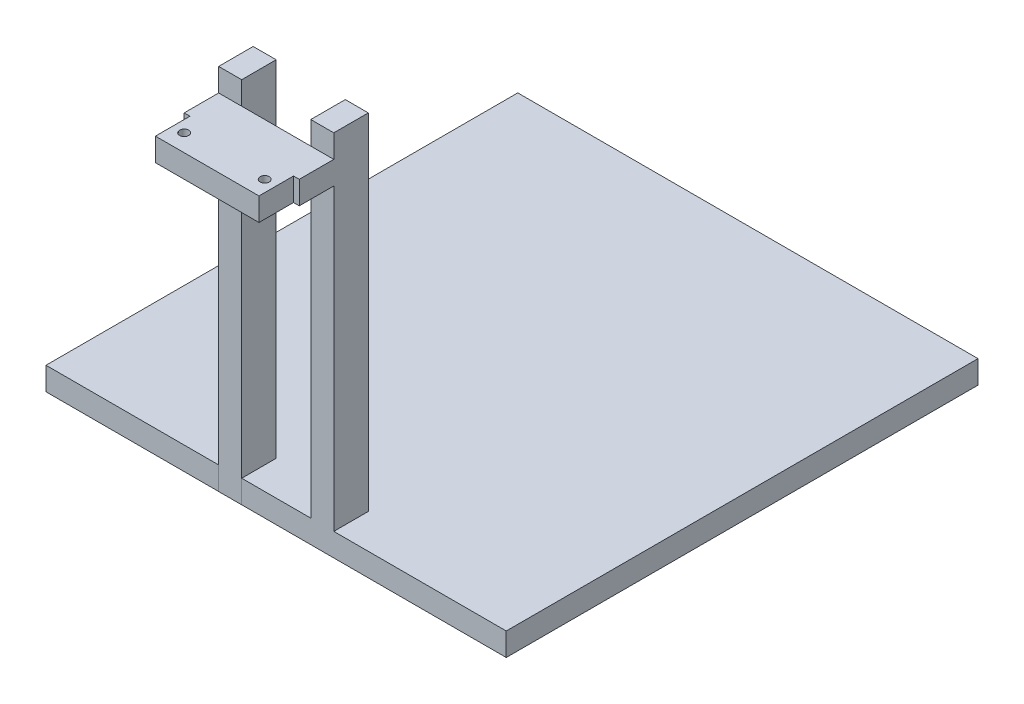
ISO-10303-21;
HEADER;
FILE_DESCRIPTION(('STEP AP214'),'2;1');
FILE_NAME('part.step','',(''),(''),'','','');
FILE_SCHEMA(('AUTOMOTIVE_DESIGN { 1 0 10303 214 1 1 1 1 }'));
ENDSEC;
DATA;
#1=APPLICATION_CONTEXT('core data for automotive mechanical design processes');
#2=APPLICATION_PROTOCOL_DEFINITION('international standard','automotive_design',2000,#1);
#3=PRODUCT_CONTEXT('',#1,'mechanical');
#4=PRODUCT('Part','Part','',(#3));
#5=PRODUCT_RELATED_PRODUCT_CATEGORY('part','',(#4));
#6=PRODUCT_DEFINITION_FORMATION('','',#4);
#7=PRODUCT_DEFINITION_CONTEXT('part definition',#1,'design');
#8=PRODUCT_DEFINITION('design','',#6,#7);
#9=PRODUCT_DEFINITION_SHAPE('','',#8);
#10=(LENGTH_UNIT() NAMED_UNIT(*) SI_UNIT(.MILLI.,.METRE.));
#11=(NAMED_UNIT(*) PLANE_ANGLE_UNIT() SI_UNIT($,.RADIAN.));
#12=(NAMED_UNIT(*) SI_UNIT($,.STERADIAN.) SOLID_ANGLE_UNIT());
#13=UNCERTAINTY_MEASURE_WITH_UNIT(LENGTH_MEASURE(1.E-05),#10,'distance_accuracy_value','');
#14=(GEOMETRIC_REPRESENTATION_CONTEXT(3) GLOBAL_UNCERTAINTY_ASSIGNED_CONTEXT((#13)) GLOBAL_UNIT_ASSIGNED_CONTEXT((#10,
#11,#12)) REPRESENTATION_CONTEXT('',''));
#15=CARTESIAN_POINT('',(0.,0.,0.));
#16=DIRECTION('',(0.,0.,1.));
#17=DIRECTION('',(1.,0.,0.));
#18=AXIS2_PLACEMENT_3D('',#15,#16,#17);
#19=CARTESIAN_POINT('',(0.,0.,117.5));
#20=DIRECTION('',(0.,0.,1.));
#21=DIRECTION('',(1.,0.,0.));
#22=AXIS2_PLACEMENT_3D('',#19,#20,#21);
#23=PLANE('',#22);
#24=DIRECTION('',(0.,-1.,0.));
#25=VECTOR('',#24,1.);
#26=CARTESIAN_POINT('',(-22.4476108924755,150.,117.5));
#27=LINE('',#26,#25);
#28=CARTESIAN_POINT('',(-22.4476108924755,150.,117.5));
#29=VERTEX_POINT('',#28);
#30=CARTESIAN_POINT('',(-22.4476108924755,140.,117.5));
#31=VERTEX_POINT('',#30);
#32=EDGE_CURVE('E57',#29,#31,#27,.T.);
#33=ORIENTED_EDGE('',*,*,#32,.F.);
#34=DIRECTION('',(1.,0.,0.));
#35=VECTOR('',#34,1.);
#36=CARTESIAN_POINT('',(0.,150.,117.5));
#37=LINE('',#36,#35);
#38=CARTESIAN_POINT('',(-24.9476043631863,150.,117.5));
#39=VERTEX_POINT('',#38);
#40=EDGE_CURVE('E233',#39,#29,#37,.T.);
#41=ORIENTED_EDGE('',*,*,#40,.F.);
#42=DIRECTION('',(0.,1.,0.));
#43=VECTOR('',#42,1.);
#44=CARTESIAN_POINT('',(-24.9476043631863,0.,117.5));
#45=LINE('',#44,#43);
#46=CARTESIAN_POINT('',(-24.9476043631863,140.,117.5));
#47=VERTEX_POINT('',#46);
#48=EDGE_CURVE('E246',#47,#39,#45,.T.);
#49=ORIENTED_EDGE('',*,*,#48,.F.);
#50=DIRECTION('',(1.,0.,0.));
#51=VECTOR('',#50,1.);
#52=CARTESIAN_POINT('',(0.,140.,117.5));
#53=LINE('',#52,#51);
#54=EDGE_CURVE('E252',#47,#31,#53,.T.);
#55=ORIENTED_EDGE('',*,*,#54,.T.);
#56=EDGE_LOOP('',(#33,#41,#49,#55));
#57=FACE_BOUND('',#56,.T.);
#58=ADVANCED_FACE('F41',(#57),#23,.T.);
#59=CARTESIAN_POINT('',(-100.,10.,102.5));
#60=DIRECTION('',(0.,0.,-1.));
#61=DIRECTION('',(-1.,0.,0.));
#62=AXIS2_PLACEMENT_3D('',#59,#60,#61);
#63=PLANE('',#62);
#64=DIRECTION('',(1.,0.,0.));
#65=VECTOR('',#64,1.);
#66=CARTESIAN_POINT('',(0.,140.,102.5));
#67=LINE('',#66,#65);
#68=CARTESIAN_POINT('',(15.0523825782353,140.,102.5));
#69=VERTEX_POINT('',#68);
#70=CARTESIAN_POINT('',(25.0523825782353,140.,102.5));
#71=VERTEX_POINT('',#70);
#72=EDGE_CURVE('E235',#69,#71,#67,.T.);
#73=ORIENTED_EDGE('',*,*,#72,.F.);
#74=DIRECTION('',(0.,-1.,0.));
#75=VECTOR('',#74,1.);
#76=CARTESIAN_POINT('',(15.0523825782353,160.,102.5));
#77=LINE('',#76,#75);
#78=CARTESIAN_POINT('',(15.0523825782353,10.,102.5));
#79=VERTEX_POINT('',#78);
#80=EDGE_CURVE('E307',#69,#79,#77,.T.);
#81=ORIENTED_EDGE('',*,*,#80,.T.);
#82=DIRECTION('',(1.,0.,0.));
#83=VECTOR('',#82,1.);
#84=CARTESIAN_POINT('',(-100.,10.,102.5));
#85=LINE('',#84,#83);
#86=CARTESIAN_POINT('',(-14.9476252569158,10.,102.5));
#87=VERTEX_POINT('',#86);
#88=EDGE_CURVE('E417',#87,#79,#85,.T.);
#89=ORIENTED_EDGE('',*,*,#88,.F.);
#90=DIRECTION('',(0.,1.,0.));
#91=VECTOR('',#90,1.);
#92=CARTESIAN_POINT('',(-14.9476252569158,10.,102.5));
#93=LINE('',#92,#91);
#94=CARTESIAN_POINT('',(-14.9476252569158,0.,102.5));
#95=VERTEX_POINT('',#94);
#96=EDGE_CURVE('E396',#95,#87,#93,.T.);
#97=ORIENTED_EDGE('',*,*,#96,.F.);
#98=DIRECTION('',(1.,0.,0.));
#99=VECTOR('',#98,1.);
#100=CARTESIAN_POINT('',(-100.,0.,102.5));
#101=LINE('',#100,#99);
#102=CARTESIAN_POINT('',(100.,0.,102.5));
#103=VERTEX_POINT('',#102);
#104=EDGE_CURVE('E427',#95,#103,#101,.T.);
#105=ORIENTED_EDGE('',*,*,#104,.T.);
#106=DIRECTION('',(0.,-1.,0.));
#107=VECTOR('',#106,1.);
#108=CARTESIAN_POINT('',(100.,10.,102.5));
#109=LINE('',#108,#107);
#110=CARTESIAN_POINT('',(100.,10.,102.5));
#111=VERTEX_POINT('',#110);
#112=EDGE_CURVE('E416',#111,#103,#109,.T.);
#113=ORIENTED_EDGE('',*,*,#112,.F.);
#114=CARTESIAN_POINT('',(25.0523825782353,10.,102.5));
#115=VERTEX_POINT('',#114);
#116=EDGE_CURVE('E412',#115,#111,#85,.T.);
#117=ORIENTED_EDGE('',*,*,#116,.F.);
#118=DIRECTION('',(0.,-1.,0.));
#119=VECTOR('',#118,1.);
#120=CARTESIAN_POINT('',(25.0523825782353,160.,102.5));
#121=LINE('',#120,#119);
#122=EDGE_CURVE('E321',#71,#115,#121,.T.);
#123=ORIENTED_EDGE('',*,*,#122,.F.);
#124=EDGE_LOOP('',(#73,#81,#89,#97,#105,#113,#117,#123));
#125=FACE_BOUND('',#124,.T.);
#126=ADVANCED_FACE('F455',(#125),#63,.F.);
#127=CARTESIAN_POINT('',(-15.0523747157266,160.,0.0153850224800604));
#128=DIRECTION('',(-0.999999477656864,0.,0.00102209882057516));
#129=DIRECTION('',(0.00102209882057516,0.,0.999999477656864));
#130=AXIS2_PLACEMENT_3D('',#127,#128,#129);
#131=PLANE('',#130);
#132=DIRECTION('',(-0.00102209882057516,0.,-0.999999477656864));
#133=VECTOR('',#132,1.);
#134=CARTESIAN_POINT('',(-15.0523747157266,140.,0.0153850224800604));
#135=LINE('',#134,#133);
#136=CARTESIAN_POINT('',(-14.9476095866176,140.,102.515331482309));
#137=VERTEX_POINT('',#136);
#138=CARTESIAN_POINT('',(-14.9476252569158,140.,102.5));
#139=VERTEX_POINT('',#138);
#140=EDGE_CURVE('E288',#137,#139,#135,.T.);
#141=ORIENTED_EDGE('',*,*,#140,.F.);
#142=DIRECTION('',(0.,-1.,0.));
#143=VECTOR('',#142,1.);
#144=CARTESIAN_POINT('',(-14.9476095866176,160.,102.515331482309));
#145=LINE('',#144,#143);
#146=CARTESIAN_POINT('',(-14.9476095866176,0.,102.515331482309));
#147=VERTEX_POINT('',#146);
#148=EDGE_CURVE('E377',#137,#147,#145,.T.);
#149=ORIENTED_EDGE('',*,*,#148,.T.);
#150=DIRECTION('',(-0.00102209882057516,0.,-0.999999477656864));
#151=VECTOR('',#150,1.);
#152=CARTESIAN_POINT('',(-15.0523747157266,0.,0.0153850224800604));
#153=LINE('',#152,#151);
#154=EDGE_CURVE('E358',#147,#95,#153,.T.);
#155=ORIENTED_EDGE('',*,*,#154,.T.);
#156=ORIENTED_EDGE('',*,*,#96,.T.);
#157=DIRECTION('',(0.00102209882057516,0.,0.999999477656864));
#158=VECTOR('',#157,1.);
#159=CARTESIAN_POINT('',(-15.0523747157266,10.,0.0153850224800604));
#160=LINE('',#159,#158);
#161=CARTESIAN_POINT('',(-14.9629410689263,10.,87.5153393174557));
#162=VERTEX_POINT('',#161);
#163=EDGE_CURVE('E393',#162,#87,#160,.T.);
#164=ORIENTED_EDGE('',*,*,#163,.F.);
#165=DIRECTION('',(0.,-1.,0.));
#166=VECTOR('',#165,1.);
#167=CARTESIAN_POINT('',(-14.9629410689263,160.,87.5153393174557));
#168=LINE('',#167,#166);
#169=CARTESIAN_POINT('',(-14.9629410689263,160.,87.5153393174557));
#170=VERTEX_POINT('',#169);
#171=EDGE_CURVE('E373',#170,#162,#168,.T.);
#172=ORIENTED_EDGE('',*,*,#171,.F.);
#173=DIRECTION('',(-0.00102209882057516,0.,-0.999999477656864));
#174=VECTOR('',#173,1.);
#175=CARTESIAN_POINT('',(-15.0523747157266,160.,0.0153850224800604));
#176=LINE('',#175,#174);
#177=CARTESIAN_POINT('',(-14.9476095866176,160.,102.515331482309));
#178=VERTEX_POINT('',#177);
#179=EDGE_CURVE('E343',#178,#170,#176,.T.);
#180=ORIENTED_EDGE('',*,*,#179,.F.);
#181=CARTESIAN_POINT('',(-14.9476095866176,150.,102.515331482309));
#182=VERTEX_POINT('',#181);
#183=EDGE_CURVE('E378',#178,#182,#145,.T.);
#184=ORIENTED_EDGE('',*,*,#183,.T.);
#185=DIRECTION('',(-0.00102209882057516,0.,-0.999999477656864));
#186=VECTOR('',#185,1.);
#187=CARTESIAN_POINT('',(-15.0523747157266,150.,0.0153850224800604));
#188=LINE('',#187,#186);
#189=CARTESIAN_POINT('',(-14.9476252569158,150.,102.5));
#190=VERTEX_POINT('',#189);
#191=EDGE_CURVE('E285',#182,#190,#188,.T.);
#192=ORIENTED_EDGE('',*,*,#191,.T.);
#193=DIRECTION('',(0.,1.,0.));
#194=VECTOR('',#193,1.);
#195=CARTESIAN_POINT('',(-14.9476252569158,160.,102.5));
#196=LINE('',#195,#194);
#197=EDGE_CURVE('E281',#139,#190,#196,.T.);
#198=ORIENTED_EDGE('',*,*,#197,.F.);
#199=EDGE_LOOP('',(#141,#149,#155,#156,#164,#172,#180,#184,#192,#198));
#200=FACE_BOUND('',#199,.T.);
#201=ADVANCED_FACE('F461',(#200),#131,.F.);
#202=CARTESIAN_POINT('',(0.104765129109025,160.,102.499946459829));
#203=DIRECTION('',(0.00102209882057586,0.,0.999999477656864));
#204=DIRECTION('',(0.999999477656864,0.,-0.00102209882057586));
#205=AXIS2_PLACEMENT_3D('',#202,#203,#204);
#206=PLANE('',#205);
#207=ORIENTED_EDGE('',*,*,#148,.F.);
#208=DIRECTION('',(-0.999999477656864,0.,0.00102209882057586));
#209=VECTOR('',#208,1.);
#210=CARTESIAN_POINT('',(0.104765129109025,140.,102.499946459829));
#211=LINE('',#210,#209);
#212=CARTESIAN_POINT('',(-24.9476043631863,140.,102.525552470514));
#213=VERTEX_POINT('',#212);
#214=EDGE_CURVE('E11',#137,#213,#211,.T.);
#215=ORIENTED_EDGE('',*,*,#214,.T.);
#216=DIRECTION('',(0.,-1.,0.));
#217=VECTOR('',#216,1.);
#218=CARTESIAN_POINT('',(-24.9476043631863,160.,102.525552470514));
#219=LINE('',#218,#217);
#220=CARTESIAN_POINT('',(-24.9476043631863,0.,102.525552470514));
#221=VERTEX_POINT('',#220);
#222=EDGE_CURVE('E354',#213,#221,#219,.T.);
#223=ORIENTED_EDGE('',*,*,#222,.T.);
#224=DIRECTION('',(-0.999999477656864,0.,0.00102209882057586));
#225=VECTOR('',#224,1.);
#226=CARTESIAN_POINT('',(0.104765129109025,0.,102.499946459829));
#227=LINE('',#226,#225);
#228=EDGE_CURVE('E338',#147,#221,#227,.T.);
#229=ORIENTED_EDGE('',*,*,#228,.F.);
#230=EDGE_LOOP('',(#207,#215,#223,#229));
#231=FACE_BOUND('',#230,.T.);
#232=ADVANCED_FACE('F516',(#231),#206,.T.);
#233=CARTESIAN_POINT('',(0.,10.,0.));
#234=DIRECTION('',(0.,1.,0.));
#235=DIRECTION('',(0.,0.,1.));
#236=AXIS2_PLACEMENT_3D('',#233,#234,#235);
#237=PLANE('',#236);
#238=DIRECTION('',(-1.,0.,0.));
#239=VECTOR('',#238,1.);
#240=CARTESIAN_POINT('',(0.,10.,87.5));
#241=LINE('',#240,#239);
#242=CARTESIAN_POINT('',(25.0523825782353,10.,87.5));
#243=VERTEX_POINT('',#242);
#244=CARTESIAN_POINT('',(15.0523825782353,10.,87.5));
#245=VERTEX_POINT('',#244);
#246=EDGE_CURVE('E330',#243,#245,#241,.T.);
#247=ORIENTED_EDGE('',*,*,#246,.F.);
#248=DIRECTION('',(0.,0.,1.));
#249=VECTOR('',#248,1.);
#250=CARTESIAN_POINT('',(25.0523825782353,10.,0.));
#251=LINE('',#250,#249);
#252=EDGE_CURVE('E334',#243,#115,#251,.T.);
#253=ORIENTED_EDGE('',*,*,#252,.T.);
#254=ORIENTED_EDGE('',*,*,#116,.T.);
#255=DIRECTION('',(0.,0.,-1.));
#256=VECTOR('',#255,1.);
#257=CARTESIAN_POINT('',(100.,10.,-102.5));
#258=LINE('',#257,#256);
#259=CARTESIAN_POINT('',(100.,10.,-102.5));
#260=VERTEX_POINT('',#259);
#261=EDGE_CURVE('E401',#111,#260,#258,.T.);
#262=ORIENTED_EDGE('',*,*,#261,.T.);
#263=DIRECTION('',(-1.,0.,0.));
#264=VECTOR('',#263,1.);
#265=CARTESIAN_POINT('',(-100.,10.,-102.5));
#266=LINE('',#265,#264);
#267=CARTESIAN_POINT('',(-100.,10.,-102.5));
#268=VERTEX_POINT('',#267);
#269=EDGE_CURVE('E405',#260,#268,#266,.T.);
#270=ORIENTED_EDGE('',*,*,#269,.T.);
#271=DIRECTION('',(0.,0.,1.));
#272=VECTOR('',#271,1.);
#273=CARTESIAN_POINT('',(-100.,10.,-102.5));
#274=LINE('',#273,#272);
#275=CARTESIAN_POINT('',(-100.,10.,102.5));
#276=VERTEX_POINT('',#275);
#277=EDGE_CURVE('E409',#268,#276,#274,.T.);
#278=ORIENTED_EDGE('',*,*,#277,.T.);
#279=CARTESIAN_POINT('',(-24.9476304803499,10.,102.5));
#280=VERTEX_POINT('',#279);
#281=EDGE_CURVE('E413',#276,#280,#85,.T.);
#282=ORIENTED_EDGE('',*,*,#281,.T.);
#283=DIRECTION('',(0.00102209882057539,0.,0.999999477656864));
#284=VECTOR('',#283,1.);
#285=CARTESIAN_POINT('',(-25.0523694922953,10.,0.0256060106858179));
#286=LINE('',#285,#284);
#287=CARTESIAN_POINT('',(-24.9629358454949,10.,87.5255603056614));
#288=VERTEX_POINT('',#287);
#289=EDGE_CURVE('E382',#288,#280,#286,.T.);
#290=ORIENTED_EDGE('',*,*,#289,.F.);
#291=DIRECTION('',(0.999999477656864,0.,-0.00102209882057586));
#292=VECTOR('',#291,1.);
#293=CARTESIAN_POINT('',(0.0894336468003874,10.,87.4999542949756));
#294=LINE('',#293,#292);
#295=EDGE_CURVE('E390',#288,#162,#294,.T.);
#296=ORIENTED_EDGE('',*,*,#295,.T.);
#297=ORIENTED_EDGE('',*,*,#163,.T.);
#298=ORIENTED_EDGE('',*,*,#88,.T.);
#299=DIRECTION('',(0.,0.,1.));
#300=VECTOR('',#299,1.);
#301=CARTESIAN_POINT('',(15.0523825782353,10.,0.));
#302=LINE('',#301,#300);
#303=EDGE_CURVE('E326',#245,#79,#302,.T.);
#304=ORIENTED_EDGE('',*,*,#303,.F.);
#305=EDGE_LOOP('',(#247,#253,#254,#262,#270,#278,#282,#290,#296,#297,#298,#304));
#306=FACE_BOUND('',#305,.T.);
#307=ADVANCED_FACE('F520',(#306),#237,.T.);
#308=CARTESIAN_POINT('',(15.0523825782353,160.,102.5));
#309=VERTEX_POINT('',#308);
#310=CARTESIAN_POINT('',(15.0523825782353,150.,102.5));
#311=VERTEX_POINT('',#310);
#312=EDGE_CURVE('E308',#309,#311,#77,.T.);
#313=ORIENTED_EDGE('',*,*,#312,.T.);
#314=DIRECTION('',(1.,0.,0.));
#315=VECTOR('',#314,1.);
#316=CARTESIAN_POINT('',(0.,150.,102.5));
#317=LINE('',#316,#315);
#318=CARTESIAN_POINT('',(25.0523825782353,150.,102.5));
#319=VERTEX_POINT('',#318);
#320=EDGE_CURVE('E263',#311,#319,#317,.T.);
#321=ORIENTED_EDGE('',*,*,#320,.T.);
#322=CARTESIAN_POINT('',(25.0523825782353,160.,102.5));
#323=VERTEX_POINT('',#322);
#324=EDGE_CURVE('E322',#323,#319,#121,.T.);
#325=ORIENTED_EDGE('',*,*,#324,.F.);
#326=DIRECTION('',(1.,0.,0.));
#327=VECTOR('',#326,1.);
#328=CARTESIAN_POINT('',(0.,160.,102.5));
#329=LINE('',#328,#327);
#330=EDGE_CURVE('E292',#309,#323,#329,.T.);
#331=ORIENTED_EDGE('',*,*,#330,.F.);
#332=EDGE_LOOP('',(#313,#321,#325,#331));
#333=FACE_BOUND('',#332,.T.);
#334=ADVANCED_FACE('F464',(#333),#63,.F.);
#335=CARTESIAN_POINT('',(100.,10.,-102.5));
#336=DIRECTION('',(-1.,0.,0.));
#337=DIRECTION('',(0.,0.,1.));
#338=AXIS2_PLACEMENT_3D('',#335,#336,#337);
#339=PLANE('',#338);
#340=DIRECTION('',(0.,0.,-1.));
#341=VECTOR('',#340,1.);
#342=CARTESIAN_POINT('',(100.,0.,-102.5));
#343=LINE('',#342,#341);
#344=CARTESIAN_POINT('',(100.,0.,-102.5));
#345=VERTEX_POINT('',#344);
#346=EDGE_CURVE('E400',#103,#345,#343,.T.);
#347=ORIENTED_EDGE('',*,*,#346,.T.);
#348=DIRECTION('',(0.,-1.,0.));
#349=VECTOR('',#348,1.);
#350=CARTESIAN_POINT('',(100.,10.,-102.5));
#351=LINE('',#350,#349);
#352=EDGE_CURVE('E441',#260,#345,#351,.T.);
#353=ORIENTED_EDGE('',*,*,#352,.F.);
#354=ORIENTED_EDGE('',*,*,#261,.F.);
#355=ORIENTED_EDGE('',*,*,#112,.T.);
#356=EDGE_LOOP('',(#347,#353,#354,#355));
#357=FACE_BOUND('',#356,.T.);
#358=ADVANCED_FACE('F43',(#357),#339,.F.);
#359=CARTESIAN_POINT('',(-100.,10.,-102.5));
#360=DIRECTION('',(0.,0.,1.));
#361=DIRECTION('',(1.,0.,0.));
#362=AXIS2_PLACEMENT_3D('',#359,#360,#361);
#363=PLANE('',#362);
#364=DIRECTION('',(-1.,0.,0.));
#365=VECTOR('',#364,1.);
#366=CARTESIAN_POINT('',(-100.,0.,-102.5));
#367=LINE('',#366,#365);
#368=CARTESIAN_POINT('',(-100.,0.,-102.5));
#369=VERTEX_POINT('',#368);
#370=EDGE_CURVE('E421',#345,#369,#367,.T.);
#371=ORIENTED_EDGE('',*,*,#370,.T.);
#372=DIRECTION('',(0.,-1.,0.));
#373=VECTOR('',#372,1.);
#374=CARTESIAN_POINT('',(-100.,10.,-102.5));
#375=LINE('',#374,#373);
#376=EDGE_CURVE('E437',#268,#369,#375,.T.);
#377=ORIENTED_EDGE('',*,*,#376,.F.);
#378=ORIENTED_EDGE('',*,*,#269,.F.);
#379=ORIENTED_EDGE('',*,*,#352,.T.);
#380=EDGE_LOOP('',(#371,#377,#378,#379));
#381=FACE_BOUND('',#380,.T.);
#382=ADVANCED_FACE('F531',(#381),#363,.F.);
#383=CARTESIAN_POINT('',(-100.,10.,-102.5));
#384=DIRECTION('',(1.,0.,0.));
#385=DIRECTION('',(0.,0.,-1.));
#386=AXIS2_PLACEMENT_3D('',#383,#384,#385);
#387=PLANE('',#386);
#388=DIRECTION('',(0.,0.,1.));
#389=VECTOR('',#388,1.);
#390=CARTESIAN_POINT('',(-100.,0.,-102.5));
#391=LINE('',#390,#389);
#392=CARTESIAN_POINT('',(-100.,0.,102.5));
#393=VERTEX_POINT('',#392);
#394=EDGE_CURVE('E424',#369,#393,#391,.T.);
#395=ORIENTED_EDGE('',*,*,#394,.T.);
#396=DIRECTION('',(0.,-1.,0.));
#397=VECTOR('',#396,1.);
#398=CARTESIAN_POINT('',(-100.,10.,102.5));
#399=LINE('',#398,#397);
#400=EDGE_CURVE('E433',#276,#393,#399,.T.);
#401=ORIENTED_EDGE('',*,*,#400,.F.);
#402=ORIENTED_EDGE('',*,*,#277,.F.);
#403=ORIENTED_EDGE('',*,*,#376,.T.);
#404=EDGE_LOOP('',(#395,#401,#402,#403));
#405=FACE_BOUND('',#404,.T.);
#406=ADVANCED_FACE('F528',(#405),#387,.F.);
#407=CARTESIAN_POINT('',(-24.9476304803499,0.,102.5));
#408=VERTEX_POINT('',#407);
#409=EDGE_CURVE('E406',#393,#408,#101,.T.);
#410=ORIENTED_EDGE('',*,*,#409,.T.);
#411=DIRECTION('',(0.,1.,0.));
#412=VECTOR('',#411,1.);
#413=CARTESIAN_POINT('',(-24.9476304803499,10.,102.5));
#414=LINE('',#413,#412);
#415=EDGE_CURVE('E386',#408,#280,#414,.T.);
#416=ORIENTED_EDGE('',*,*,#415,.T.);
#417=ORIENTED_EDGE('',*,*,#281,.F.);
#418=ORIENTED_EDGE('',*,*,#400,.T.);
#419=EDGE_LOOP('',(#410,#416,#417,#418));
#420=FACE_BOUND('',#419,.T.);
#421=ADVANCED_FACE('F465',(#420),#63,.F.);
#422=CARTESIAN_POINT('',(0.,0.,0.));
#423=DIRECTION('',(0.,1.,0.));
#424=DIRECTION('',(0.,0.,1.));
#425=AXIS2_PLACEMENT_3D('',#422,#423,#424);
#426=PLANE('',#425);
#427=ORIENTED_EDGE('',*,*,#346,.F.);
#428=ORIENTED_EDGE('',*,*,#104,.F.);
#429=ORIENTED_EDGE('',*,*,#154,.F.);
#430=ORIENTED_EDGE('',*,*,#228,.T.);
#431=DIRECTION('',(-0.00102209882057539,0.,-0.999999477656864));
#432=VECTOR('',#431,1.);
#433=CARTESIAN_POINT('',(-25.0523694922953,0.,0.0256060106858179));
#434=LINE('',#433,#432);
#435=EDGE_CURVE('E344',#221,#408,#434,.T.);
#436=ORIENTED_EDGE('',*,*,#435,.T.);
#437=ORIENTED_EDGE('',*,*,#409,.F.);
#438=ORIENTED_EDGE('',*,*,#394,.F.);
#439=ORIENTED_EDGE('',*,*,#370,.F.);
#440=EDGE_LOOP('',(#427,#428,#429,#430,#436,#437,#438,#439));
#441=FACE_BOUND('',#440,.T.);
#442=ADVANCED_FACE('F509',(#441),#426,.F.);
#443=CARTESIAN_POINT('',(-25.0523694922953,160.,0.0256060106858179));
#444=DIRECTION('',(-0.999999477656864,0.,0.00102209882057539));
#445=DIRECTION('',(0.00102209882057539,0.,0.999999477656864));
#446=AXIS2_PLACEMENT_3D('',#443,#444,#445);
#447=PLANE('',#446);
#448=ORIENTED_EDGE('',*,*,#415,.F.);
#449=ORIENTED_EDGE('',*,*,#435,.F.);
#450=ORIENTED_EDGE('',*,*,#222,.F.);
#451=CARTESIAN_POINT('',(-24.9476043631863,150.,102.525552470514));
#452=VERTEX_POINT('',#451);
#453=EDGE_CURVE('E369',#452,#213,#219,.T.);
#454=ORIENTED_EDGE('',*,*,#453,.F.);
#455=CARTESIAN_POINT('',(-24.9476043631863,160.,102.525552470514));
#456=VERTEX_POINT('',#455);
#457=EDGE_CURVE('E365',#456,#452,#219,.T.);
#458=ORIENTED_EDGE('',*,*,#457,.F.);
#459=DIRECTION('',(-0.00102209882057539,0.,-0.999999477656864));
#460=VECTOR('',#459,1.);
#461=CARTESIAN_POINT('',(-25.0523694922953,160.,0.0256060106858179));
#462=LINE('',#461,#460);
#463=CARTESIAN_POINT('',(-24.9629358454949,160.,87.5255603056614));
#464=VERTEX_POINT('',#463);
#465=EDGE_CURVE('E350',#456,#464,#462,.T.);
#466=ORIENTED_EDGE('',*,*,#465,.T.);
#467=DIRECTION('',(0.,-1.,0.));
#468=VECTOR('',#467,1.);
#469=CARTESIAN_POINT('',(-24.9629358454949,160.,87.5255603056614));
#470=LINE('',#469,#468);
#471=EDGE_CURVE('E368',#464,#288,#470,.T.);
#472=ORIENTED_EDGE('',*,*,#471,.T.);
#473=ORIENTED_EDGE('',*,*,#289,.T.);
#474=EDGE_LOOP('',(#448,#449,#450,#454,#458,#466,#472,#473));
#475=FACE_BOUND('',#474,.T.);
#476=ADVANCED_FACE('F505',(#475),#447,.T.);
#477=DIRECTION('',(-0.999999477656864,0.,0.00102209882057586));
#478=VECTOR('',#477,1.);
#479=CARTESIAN_POINT('',(0.104765129109025,150.,102.499946459829));
#480=LINE('',#479,#478);
#481=EDGE_CURVE('E50',#182,#452,#480,.T.);
#482=ORIENTED_EDGE('',*,*,#481,.F.);
#483=ORIENTED_EDGE('',*,*,#183,.F.);
#484=DIRECTION('',(-0.999999477656864,0.,0.00102209882057586));
#485=VECTOR('',#484,1.);
#486=CARTESIAN_POINT('',(0.104765129109025,160.,102.499946459829));
#487=LINE('',#486,#485);
#488=EDGE_CURVE('E339',#178,#456,#487,.T.);
#489=ORIENTED_EDGE('',*,*,#488,.T.);
#490=ORIENTED_EDGE('',*,*,#457,.T.);
#491=EDGE_LOOP('',(#482,#483,#489,#490));
#492=FACE_BOUND('',#491,.T.);
#493=ADVANCED_FACE('F508',(#492),#206,.T.);
#494=CARTESIAN_POINT('',(0.0894336468003874,160.,87.4999542949756));
#495=DIRECTION('',(0.00102209882057586,0.,0.999999477656864));
#496=DIRECTION('',(0.999999477656864,0.,-0.00102209882057586));
#497=AXIS2_PLACEMENT_3D('',#494,#495,#496);
#498=PLANE('',#497);
#499=ORIENTED_EDGE('',*,*,#295,.F.);
#500=ORIENTED_EDGE('',*,*,#471,.F.);
#501=DIRECTION('',(-0.999999477656864,0.,0.00102209882057586));
#502=VECTOR('',#501,1.);
#503=CARTESIAN_POINT('',(0.0894336468003874,160.,87.4999542949756));
#504=LINE('',#503,#502);
#505=EDGE_CURVE('E347',#170,#464,#504,.T.);
#506=ORIENTED_EDGE('',*,*,#505,.F.);
#507=ORIENTED_EDGE('',*,*,#171,.T.);
#508=EDGE_LOOP('',(#499,#500,#506,#507));
#509=FACE_BOUND('',#508,.T.);
#510=ADVANCED_FACE('F503',(#509),#498,.F.);
#511=CARTESIAN_POINT('',(0.,160.,0.));
#512=DIRECTION('',(0.,1.,0.));
#513=DIRECTION('',(0.,0.,1.));
#514=AXIS2_PLACEMENT_3D('',#511,#512,#513);
#515=PLANE('',#514);
#516=ORIENTED_EDGE('',*,*,#488,.F.);
#517=ORIENTED_EDGE('',*,*,#179,.T.);
#518=ORIENTED_EDGE('',*,*,#505,.T.);
#519=ORIENTED_EDGE('',*,*,#465,.F.);
#520=EDGE_LOOP('',(#516,#517,#518,#519));
#521=FACE_BOUND('',#520,.T.);
#522=ADVANCED_FACE('F499',(#521),#515,.T.);
#523=CARTESIAN_POINT('',(25.0523825782353,160.,0.));
#524=DIRECTION('',(-1.,0.,0.));
#525=DIRECTION('',(0.,0.,1.));
#526=AXIS2_PLACEMENT_3D('',#523,#524,#525);
#527=PLANE('',#526);
#528=ORIENTED_EDGE('',*,*,#252,.F.);
#529=DIRECTION('',(0.,-1.,0.));
#530=VECTOR('',#529,1.);
#531=CARTESIAN_POINT('',(25.0523825782353,160.,87.5));
#532=LINE('',#531,#530);
#533=CARTESIAN_POINT('',(25.0523825782353,160.,87.5));
#534=VERTEX_POINT('',#533);
#535=EDGE_CURVE('E317',#534,#243,#532,.T.);
#536=ORIENTED_EDGE('',*,*,#535,.F.);
#537=DIRECTION('',(0.,0.,-1.));
#538=VECTOR('',#537,1.);
#539=CARTESIAN_POINT('',(25.0523825782353,160.,0.));
#540=LINE('',#539,#538);
#541=EDGE_CURVE('E296',#323,#534,#540,.T.);
#542=ORIENTED_EDGE('',*,*,#541,.F.);
#543=ORIENTED_EDGE('',*,*,#324,.T.);
#544=DIRECTION('',(0.,0.,-1.));
#545=VECTOR('',#544,1.);
#546=CARTESIAN_POINT('',(25.0523825782353,150.,117.5));
#547=LINE('',#546,#545);
#548=CARTESIAN_POINT('',(25.0523825782353,150.,117.5));
#549=VERTEX_POINT('',#548);
#550=EDGE_CURVE('E269',#549,#319,#547,.T.);
#551=ORIENTED_EDGE('',*,*,#550,.F.);
#552=DIRECTION('',(0.,-1.,0.));
#553=VECTOR('',#552,1.);
#554=CARTESIAN_POINT('',(25.0523825782353,0.,117.5));
#555=LINE('',#554,#553);
#556=CARTESIAN_POINT('',(25.0523825782353,140.,117.5));
#557=VERTEX_POINT('',#556);
#558=EDGE_CURVE('E255',#549,#557,#555,.T.);
#559=ORIENTED_EDGE('',*,*,#558,.T.);
#560=DIRECTION('',(0.,0.,-1.));
#561=VECTOR('',#560,1.);
#562=CARTESIAN_POINT('',(25.0523825782353,140.,117.5));
#563=LINE('',#562,#561);
#564=EDGE_CURVE('E273',#557,#71,#563,.T.);
#565=ORIENTED_EDGE('',*,*,#564,.T.);
#566=ORIENTED_EDGE('',*,*,#122,.T.);
#567=EDGE_LOOP('',(#528,#536,#542,#543,#551,#559,#565,#566));
#568=FACE_BOUND('',#567,.T.);
#569=ADVANCED_FACE('F495',(#568),#527,.F.);
#570=CARTESIAN_POINT('',(0.,160.,87.5));
#571=DIRECTION('',(0.,0.,-1.));
#572=DIRECTION('',(-1.,0.,0.));
#573=AXIS2_PLACEMENT_3D('',#570,#571,#572);
#574=PLANE('',#573);
#575=ORIENTED_EDGE('',*,*,#535,.T.);
#576=ORIENTED_EDGE('',*,*,#246,.T.);
#577=DIRECTION('',(0.,-1.,0.));
#578=VECTOR('',#577,1.);
#579=CARTESIAN_POINT('',(15.0523825782353,160.,87.5));
#580=LINE('',#579,#578);
#581=CARTESIAN_POINT('',(15.0523825782353,160.,87.5));
#582=VERTEX_POINT('',#581);
#583=EDGE_CURVE('E312',#582,#245,#580,.T.);
#584=ORIENTED_EDGE('',*,*,#583,.F.);
#585=DIRECTION('',(1.,0.,0.));
#586=VECTOR('',#585,1.);
#587=CARTESIAN_POINT('',(0.,160.,87.5));
#588=LINE('',#587,#586);
#589=EDGE_CURVE('E299',#582,#534,#588,.T.);
#590=ORIENTED_EDGE('',*,*,#589,.T.);
#591=EDGE_LOOP('',(#575,#576,#584,#590));
#592=FACE_BOUND('',#591,.T.);
#593=ADVANCED_FACE('F491',(#592),#574,.T.);
#594=CARTESIAN_POINT('',(15.0523825782353,160.,0.));
#595=DIRECTION('',(-1.,0.,0.));
#596=DIRECTION('',(0.,0.,1.));
#597=AXIS2_PLACEMENT_3D('',#594,#595,#596);
#598=PLANE('',#597);
#599=ORIENTED_EDGE('',*,*,#583,.T.);
#600=ORIENTED_EDGE('',*,*,#303,.T.);
#601=ORIENTED_EDGE('',*,*,#80,.F.);
#602=EDGE_CURVE('E313',#311,#69,#77,.T.);
#603=ORIENTED_EDGE('',*,*,#602,.F.);
#604=ORIENTED_EDGE('',*,*,#312,.F.);
#605=DIRECTION('',(0.,0.,-1.));
#606=VECTOR('',#605,1.);
#607=CARTESIAN_POINT('',(15.0523825782353,160.,0.));
#608=LINE('',#607,#606);
#609=EDGE_CURVE('E303',#309,#582,#608,.T.);
#610=ORIENTED_EDGE('',*,*,#609,.T.);
#611=EDGE_LOOP('',(#599,#600,#601,#603,#604,#610));
#612=FACE_BOUND('',#611,.T.);
#613=ADVANCED_FACE('F487',(#612),#598,.T.);
#614=CARTESIAN_POINT('',(0.,160.,0.));
#615=DIRECTION('',(0.,1.,0.));
#616=DIRECTION('',(0.,0.,1.));
#617=AXIS2_PLACEMENT_3D('',#614,#615,#616);
#618=PLANE('',#617);
#619=ORIENTED_EDGE('',*,*,#330,.T.);
#620=ORIENTED_EDGE('',*,*,#541,.T.);
#621=ORIENTED_EDGE('',*,*,#589,.F.);
#622=ORIENTED_EDGE('',*,*,#609,.F.);
#623=EDGE_LOOP('',(#619,#620,#621,#622));
#624=FACE_BOUND('',#623,.T.);
#625=ADVANCED_FACE('F484',(#624),#618,.T.);
#626=CARTESIAN_POINT('',(0.,140.,117.5));
#627=DIRECTION('',(0.,1.,0.));
#628=DIRECTION('',(0.,0.,1.));
#629=AXIS2_PLACEMENT_3D('',#626,#627,#628);
#630=PLANE('',#629);
#631=CARTESIAN_POINT('',(17.5523891075245,140.,125.));
#632=DIRECTION('',(0.,1.,0.));
#633=DIRECTION('',(0.,0.,1.));
#634=AXIS2_PLACEMENT_3D('',#631,#632,#633);
#635=CIRCLE('',#634,2.);
#636=CARTESIAN_POINT('',(17.5523891075245,140.,127.));
#637=VERTEX_POINT('',#636);
#638=EDGE_CURVE('E610',#637,#637,#635,.T.);
#639=ORIENTED_EDGE('',*,*,#638,.T.);
#640=EDGE_LOOP('',(#639));
#641=FACE_BOUND('',#640,.T.);
#642=CARTESIAN_POINT('',(-17.4476108924755,140.,125.));
#643=DIRECTION('',(0.,1.,0.));
#644=DIRECTION('',(0.,0.,1.));
#645=AXIS2_PLACEMENT_3D('',#642,#643,#644);
#646=CIRCLE('',#645,2.);
#647=CARTESIAN_POINT('',(-17.4476108924755,140.,127.));
#648=VERTEX_POINT('',#647);
#649=EDGE_CURVE('E619',#648,#648,#646,.T.);
#650=ORIENTED_EDGE('',*,*,#649,.T.);
#651=EDGE_LOOP('',(#650));
#652=FACE_BOUND('',#651,.T.);
#653=ORIENTED_EDGE('',*,*,#214,.F.);
#654=ORIENTED_EDGE('',*,*,#140,.T.);
#655=EDGE_CURVE('E240',#139,#69,#67,.T.);
#656=ORIENTED_EDGE('',*,*,#655,.T.);
#657=ORIENTED_EDGE('',*,*,#72,.T.);
#658=ORIENTED_EDGE('',*,*,#564,.F.);
#659=CARTESIAN_POINT('',(22.5523891075245,140.,117.5));
#660=VERTEX_POINT('',#659);
#661=EDGE_CURVE('E250',#660,#557,#53,.T.);
#662=ORIENTED_EDGE('',*,*,#661,.F.);
#663=DIRECTION('',(0.,0.,-1.));
#664=VECTOR('',#663,1.);
#665=CARTESIAN_POINT('',(22.5523891075245,140.,132.5));
#666=LINE('',#665,#664);
#667=CARTESIAN_POINT('',(22.5523891075245,140.,132.5));
#668=VERTEX_POINT('',#667);
#669=EDGE_CURVE('E242',#668,#660,#666,.T.);
#670=ORIENTED_EDGE('',*,*,#669,.F.);
#671=DIRECTION('',(1.,0.,0.));
#672=VECTOR('',#671,1.);
#673=CARTESIAN_POINT('',(-22.4476108924755,140.,132.5));
#674=LINE('',#673,#672);
#675=CARTESIAN_POINT('',(-22.4476108924755,140.,132.5));
#676=VERTEX_POINT('',#675);
#677=EDGE_CURVE('E219',#676,#668,#674,.T.);
#678=ORIENTED_EDGE('',*,*,#677,.F.);
#679=DIRECTION('',(0.,0.,-1.));
#680=VECTOR('',#679,1.);
#681=CARTESIAN_POINT('',(-22.4476108924755,140.,132.5));
#682=LINE('',#681,#680);
#683=EDGE_CURVE('E215',#676,#31,#682,.T.);
#684=ORIENTED_EDGE('',*,*,#683,.T.);
#685=ORIENTED_EDGE('',*,*,#54,.F.);
#686=DIRECTION('',(0.,0.,-1.));
#687=VECTOR('',#686,1.);
#688=CARTESIAN_POINT('',(-24.9476043631863,140.,117.5));
#689=LINE('',#688,#687);
#690=EDGE_CURVE('E277',#47,#213,#689,.T.);
#691=ORIENTED_EDGE('',*,*,#690,.T.);
#692=EDGE_LOOP('',(#653,#654,#656,#657,#658,#662,#670,#678,#684,#685,#691));
#693=FACE_BOUND('',#692,.T.);
#694=ADVANCED_FACE('F482',(#641,#652,#693),#630,.F.);
#695=CARTESIAN_POINT('',(0.,150.,117.5));
#696=DIRECTION('',(0.,1.,0.));
#697=DIRECTION('',(0.,0.,1.));
#698=AXIS2_PLACEMENT_3D('',#695,#696,#697);
#699=PLANE('',#698);
#700=CARTESIAN_POINT('',(17.5523891075245,150.,125.));
#701=DIRECTION('',(0.,1.,0.));
#702=DIRECTION('',(0.,0.,1.));
#703=AXIS2_PLACEMENT_3D('',#700,#701,#702);
#704=CIRCLE('',#703,2.);
#705=CARTESIAN_POINT('',(17.5523891075245,150.,127.));
#706=VERTEX_POINT('',#705);
#707=EDGE_CURVE('E623',#706,#706,#704,.T.);
#708=ORIENTED_EDGE('',*,*,#707,.F.);
#709=EDGE_LOOP('',(#708));
#710=FACE_BOUND('',#709,.T.);
#711=CARTESIAN_POINT('',(-17.4476108924755,150.,125.));
#712=DIRECTION('',(0.,1.,0.));
#713=DIRECTION('',(0.,0.,1.));
#714=AXIS2_PLACEMENT_3D('',#711,#712,#713);
#715=CIRCLE('',#714,2.);
#716=CARTESIAN_POINT('',(-17.4476108924755,150.,127.));
#717=VERTEX_POINT('',#716);
#718=EDGE_CURVE('E615',#717,#717,#715,.T.);
#719=ORIENTED_EDGE('',*,*,#718,.F.);
#720=EDGE_LOOP('',(#719));
#721=FACE_BOUND('',#720,.T.);
#722=ORIENTED_EDGE('',*,*,#191,.F.);
#723=ORIENTED_EDGE('',*,*,#481,.T.);
#724=DIRECTION('',(0.,0.,-1.));
#725=VECTOR('',#724,1.);
#726=CARTESIAN_POINT('',(-24.9476043631863,150.,117.5));
#727=LINE('',#726,#725);
#728=EDGE_CURVE('E261',#39,#452,#727,.T.);
#729=ORIENTED_EDGE('',*,*,#728,.F.);
#730=ORIENTED_EDGE('',*,*,#40,.T.);
#731=DIRECTION('',(0.,0.,-1.));
#732=VECTOR('',#731,1.);
#733=CARTESIAN_POINT('',(-22.4476108924755,150.,132.5));
#734=LINE('',#733,#732);
#735=CARTESIAN_POINT('',(-22.4476108924755,150.,132.5));
#736=VERTEX_POINT('',#735);
#737=EDGE_CURVE('E213',#736,#29,#734,.T.);
#738=ORIENTED_EDGE('',*,*,#737,.F.);
#739=DIRECTION('',(-1.,0.,0.));
#740=VECTOR('',#739,1.);
#741=CARTESIAN_POINT('',(0.0523891075245239,150.,132.5));
#742=LINE('',#741,#740);
#743=CARTESIAN_POINT('',(22.5523891075245,150.,132.5));
#744=VERTEX_POINT('',#743);
#745=EDGE_CURVE('E220',#744,#736,#742,.T.);
#746=ORIENTED_EDGE('',*,*,#745,.F.);
#747=DIRECTION('',(0.,0.,-1.));
#748=VECTOR('',#747,1.);
#749=CARTESIAN_POINT('',(22.5523891075245,150.,132.5));
#750=LINE('',#749,#748);
#751=CARTESIAN_POINT('',(22.5523891075245,150.,117.5));
#752=VERTEX_POINT('',#751);
#753=EDGE_CURVE('E602',#744,#752,#750,.T.);
#754=ORIENTED_EDGE('',*,*,#753,.T.);
#755=EDGE_CURVE('E259',#752,#549,#37,.T.);
#756=ORIENTED_EDGE('',*,*,#755,.T.);
#757=ORIENTED_EDGE('',*,*,#550,.T.);
#758=ORIENTED_EDGE('',*,*,#320,.F.);
#759=EDGE_CURVE('E251',#190,#311,#317,.T.);
#760=ORIENTED_EDGE('',*,*,#759,.F.);
#761=EDGE_LOOP('',(#722,#723,#729,#730,#738,#746,#754,#756,#757,#758,#760));
#762=FACE_BOUND('',#761,.T.);
#763=ADVANCED_FACE('F232',(#710,#721,#762),#699,.T.);
#764=CARTESIAN_POINT('',(0.,0.,102.5));
#765=DIRECTION('',(0.,0.,1.));
#766=DIRECTION('',(1.,0.,0.));
#767=AXIS2_PLACEMENT_3D('',#764,#765,#766);
#768=PLANE('',#767);
#769=ORIENTED_EDGE('',*,*,#655,.F.);
#770=ORIENTED_EDGE('',*,*,#197,.T.);
#771=ORIENTED_EDGE('',*,*,#759,.T.);
#772=ORIENTED_EDGE('',*,*,#602,.T.);
#773=EDGE_LOOP('',(#769,#770,#771,#772));
#774=FACE_BOUND('',#773,.T.);
#775=ADVANCED_FACE('F474',(#774),#768,.F.);
#776=CARTESIAN_POINT('',(-24.9476043631863,0.,117.5));
#777=DIRECTION('',(-1.,0.,0.));
#778=DIRECTION('',(0.,0.,1.));
#779=AXIS2_PLACEMENT_3D('',#776,#777,#778);
#780=PLANE('',#779);
#781=ORIENTED_EDGE('',*,*,#728,.T.);
#782=ORIENTED_EDGE('',*,*,#453,.T.);
#783=ORIENTED_EDGE('',*,*,#690,.F.);
#784=ORIENTED_EDGE('',*,*,#48,.T.);
#785=EDGE_LOOP('',(#781,#782,#783,#784));
#786=FACE_BOUND('',#785,.T.);
#787=ADVANCED_FACE('F450',(#786),#780,.T.);
#788=DIRECTION('',(0.,1.,0.));
#789=VECTOR('',#788,1.);
#790=CARTESIAN_POINT('',(22.5523891075245,140.,117.5));
#791=LINE('',#790,#789);
#792=EDGE_CURVE('E65',#660,#752,#791,.T.);
#793=ORIENTED_EDGE('',*,*,#792,.F.);
#794=ORIENTED_EDGE('',*,*,#661,.T.);
#795=ORIENTED_EDGE('',*,*,#558,.F.);
#796=ORIENTED_EDGE('',*,*,#755,.F.);
#797=EDGE_LOOP('',(#793,#794,#795,#796));
#798=FACE_BOUND('',#797,.T.);
#799=ADVANCED_FACE('F457',(#798),#23,.T.);
#800=CARTESIAN_POINT('',(-22.4476108924755,150.,132.5));
#801=DIRECTION('',(1.,0.,0.));
#802=DIRECTION('',(0.,0.,-1.));
#803=AXIS2_PLACEMENT_3D('',#800,#801,#802);
#804=PLANE('',#803);
#805=ORIENTED_EDGE('',*,*,#32,.T.);
#806=ORIENTED_EDGE('',*,*,#683,.F.);
#807=DIRECTION('',(0.,-1.,0.));
#808=VECTOR('',#807,1.);
#809=CARTESIAN_POINT('',(-22.4476108924755,150.,132.5));
#810=LINE('',#809,#808);
#811=EDGE_CURVE('E209',#736,#676,#810,.T.);
#812=ORIENTED_EDGE('',*,*,#811,.F.);
#813=ORIENTED_EDGE('',*,*,#737,.T.);
#814=EDGE_LOOP('',(#805,#806,#812,#813));
#815=FACE_BOUND('',#814,.T.);
#816=ADVANCED_FACE('F211',(#815),#804,.F.);
#817=CARTESIAN_POINT('',(22.5523891075245,140.,132.5));
#818=DIRECTION('',(-1.,0.,0.));
#819=DIRECTION('',(0.,0.,1.));
#820=AXIS2_PLACEMENT_3D('',#817,#818,#819);
#821=PLANE('',#820);
#822=ORIENTED_EDGE('',*,*,#792,.T.);
#823=ORIENTED_EDGE('',*,*,#753,.F.);
#824=DIRECTION('',(0.,1.,0.));
#825=VECTOR('',#824,1.);
#826=CARTESIAN_POINT('',(22.5523891075245,140.,132.5));
#827=LINE('',#826,#825);
#828=EDGE_CURVE('E225',#668,#744,#827,.T.);
#829=ORIENTED_EDGE('',*,*,#828,.F.);
#830=ORIENTED_EDGE('',*,*,#669,.T.);
#831=EDGE_LOOP('',(#822,#823,#829,#830));
#832=FACE_BOUND('',#831,.T.);
#833=ADVANCED_FACE('F473',(#832),#821,.F.);
#834=CARTESIAN_POINT('',(0.,0.,132.5));
#835=DIRECTION('',(0.,0.,1.));
#836=DIRECTION('',(1.,0.,0.));
#837=AXIS2_PLACEMENT_3D('',#834,#835,#836);
#838=PLANE('',#837);
#839=ORIENTED_EDGE('',*,*,#745,.T.);
#840=ORIENTED_EDGE('',*,*,#811,.T.);
#841=ORIENTED_EDGE('',*,*,#677,.T.);
#842=ORIENTED_EDGE('',*,*,#828,.T.);
#843=EDGE_LOOP('',(#839,#840,#841,#842));
#844=FACE_BOUND('',#843,.T.);
#845=ADVANCED_FACE('F223',(#844),#838,.T.);
#846=CARTESIAN_POINT('',(-17.4476108924755,140.,125.));
#847=DIRECTION('',(0.,1.,0.));
#848=DIRECTION('',(0.,0.,1.));
#849=AXIS2_PLACEMENT_3D('',#846,#847,#848);
#850=CYLINDRICAL_SURFACE('',#849,2.);
#851=ORIENTED_EDGE('',*,*,#649,.F.);
#852=EDGE_LOOP('',(#851));
#853=FACE_BOUND('',#852,.T.);
#854=ORIENTED_EDGE('',*,*,#718,.T.);
#855=EDGE_LOOP('',(#854));
#856=FACE_BOUND('',#855,.T.);
#857=ADVANCED_FACE('F636',(#853,#856),#850,.F.);
#858=CARTESIAN_POINT('',(17.5523891075245,140.,125.));
#859=DIRECTION('',(0.,1.,0.));
#860=DIRECTION('',(0.,0.,1.));
#861=AXIS2_PLACEMENT_3D('',#858,#859,#860);
#862=CYLINDRICAL_SURFACE('',#861,2.);
#863=ORIENTED_EDGE('',*,*,#638,.F.);
#864=EDGE_LOOP('',(#863));
#865=FACE_BOUND('',#864,.T.);
#866=ORIENTED_EDGE('',*,*,#707,.T.);
#867=EDGE_LOOP('',(#866));
#868=FACE_BOUND('',#867,.T.);
#869=ADVANCED_FACE('F633',(#865,#868),#862,.F.);
#870=CLOSED_SHELL('',(#58,#126,#201,#232,#307,#334,#358,#382,#406,#421,#442,#476,#493,#510,#522,
#569,#593,#613,#625,#694,#763,#775,#787,#799,#816,#833,#845,#857,#869));
#871=MANIFOLD_SOLID_BREP('B2',#870);
#872=ADVANCED_BREP_SHAPE_REPRESENTATION('',(#18,#871),#14);
#873=SHAPE_DEFINITION_REPRESENTATION(#9,#872);
ENDSEC;
END-ISO-10303-21;
